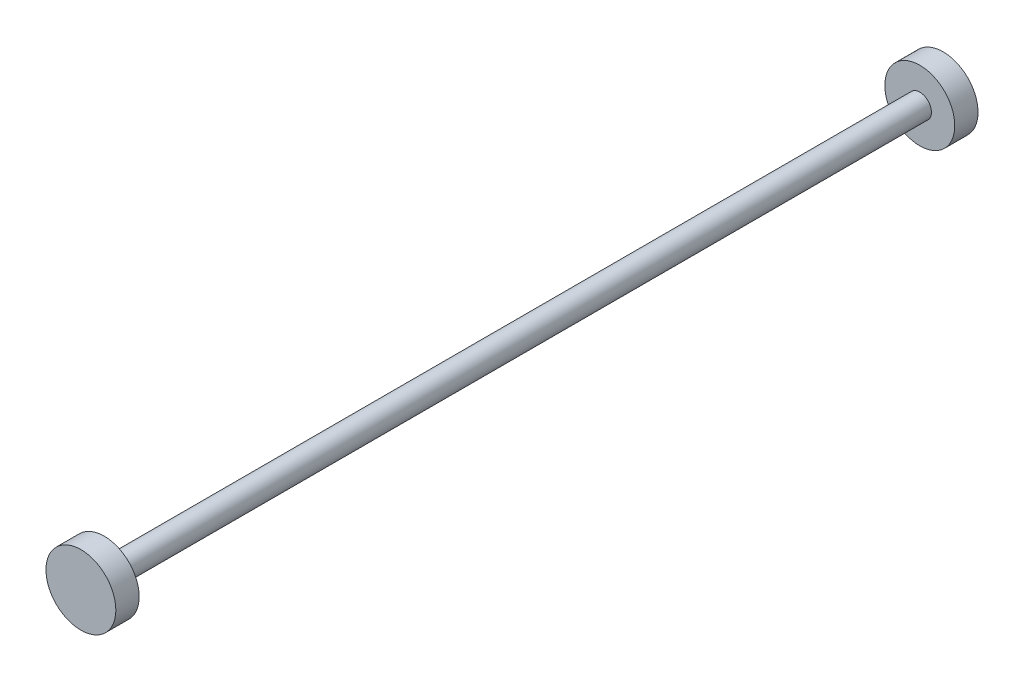
ISO-10303-21;
HEADER;
FILE_DESCRIPTION(('STEP AP214'),'2;1');
FILE_NAME('part.step','',(''),(''),'','','');
FILE_SCHEMA(('AUTOMOTIVE_DESIGN { 1 0 10303 214 1 1 1 1 }'));
ENDSEC;
DATA;
#1=APPLICATION_CONTEXT('core data for automotive mechanical design processes');
#2=APPLICATION_PROTOCOL_DEFINITION('international standard','automotive_design',2000,#1);
#3=PRODUCT_CONTEXT('',#1,'mechanical');
#4=PRODUCT('Part','Part','',(#3));
#5=PRODUCT_RELATED_PRODUCT_CATEGORY('part','',(#4));
#6=PRODUCT_DEFINITION_FORMATION('','',#4);
#7=PRODUCT_DEFINITION_CONTEXT('part definition',#1,'design');
#8=PRODUCT_DEFINITION('design','',#6,#7);
#9=PRODUCT_DEFINITION_SHAPE('','',#8);
#10=(LENGTH_UNIT() NAMED_UNIT(*) SI_UNIT(.MILLI.,.METRE.));
#11=(NAMED_UNIT(*) PLANE_ANGLE_UNIT() SI_UNIT($,.RADIAN.));
#12=(NAMED_UNIT(*) SI_UNIT($,.STERADIAN.) SOLID_ANGLE_UNIT());
#13=UNCERTAINTY_MEASURE_WITH_UNIT(LENGTH_MEASURE(1.E-05),#10,'distance_accuracy_value','');
#14=(GEOMETRIC_REPRESENTATION_CONTEXT(3) GLOBAL_UNCERTAINTY_ASSIGNED_CONTEXT((#13)) GLOBAL_UNIT_ASSIGNED_CONTEXT((#10,
#11,#12)) REPRESENTATION_CONTEXT('',''));
#15=CARTESIAN_POINT('',(0.,0.,0.));
#16=DIRECTION('',(0.,0.,1.));
#17=DIRECTION('',(1.,0.,0.));
#18=AXIS2_PLACEMENT_3D('',#15,#16,#17);
#19=CARTESIAN_POINT('',(-12.2104027011698,19.4427181472472,889.));
#20=DIRECTION('',(0.,0.,-1.));
#21=DIRECTION('',(-1.,0.,0.));
#22=AXIS2_PLACEMENT_3D('',#19,#20,#21);
#23=CYLINDRICAL_SURFACE('',#22,12.7);
#24=CARTESIAN_POINT('',(-12.2104027011698,19.4427181472472,889.));
#25=DIRECTION('',(0.,0.,1.));
#26=DIRECTION('',(1.,0.,0.));
#27=AXIS2_PLACEMENT_3D('',#24,#25,#26);
#28=CIRCLE('',#27,12.7);
#29=CARTESIAN_POINT('',(0.489597298830229,19.4427181472472,889.));
#30=VERTEX_POINT('',#29);
#31=EDGE_CURVE('E10',#30,#30,#28,.T.);
#32=ORIENTED_EDGE('',*,*,#31,.F.);
#33=EDGE_LOOP('',(#32));
#34=FACE_BOUND('',#33,.T.);
#35=CARTESIAN_POINT('',(-12.2104027011698,19.4427181472472,0.));
#36=DIRECTION('',(0.,0.,1.));
#37=DIRECTION('',(1.,0.,0.));
#38=AXIS2_PLACEMENT_3D('',#35,#36,#37);
#39=CIRCLE('',#38,12.7);
#40=CARTESIAN_POINT('',(0.489597298830229,19.4427181472472,0.));
#41=VERTEX_POINT('',#40);
#42=EDGE_CURVE('E40',#41,#41,#39,.T.);
#43=ORIENTED_EDGE('',*,*,#42,.T.);
#44=EDGE_LOOP('',(#43));
#45=FACE_BOUND('',#44,.T.);
#46=ADVANCED_FACE('F37',(#34,#45),#23,.T.);
#47=CARTESIAN_POINT('',(-12.2104027011698,19.4427181472472,914.4));
#48=DIRECTION('',(0.,0.,-1.));
#49=DIRECTION('',(-1.,0.,0.));
#50=AXIS2_PLACEMENT_3D('',#47,#48,#49);
#51=CYLINDRICAL_SURFACE('',#50,38.1);
#52=CARTESIAN_POINT('',(-12.2104027011698,19.4427181472472,914.4));
#53=DIRECTION('',(0.,0.,1.));
#54=DIRECTION('',(1.,0.,0.));
#55=AXIS2_PLACEMENT_3D('',#52,#53,#54);
#56=CIRCLE('',#55,38.1);
#57=CARTESIAN_POINT('',(25.8895972988302,19.4427181472472,914.4));
#58=VERTEX_POINT('',#57);
#59=EDGE_CURVE('E44',#58,#58,#56,.T.);
#60=ORIENTED_EDGE('',*,*,#59,.F.);
#61=EDGE_LOOP('',(#60));
#62=FACE_BOUND('',#61,.T.);
#63=CARTESIAN_POINT('',(-12.2104027011698,19.4427181472472,889.));
#64=DIRECTION('',(0.,0.,1.));
#65=DIRECTION('',(1.,0.,0.));
#66=AXIS2_PLACEMENT_3D('',#63,#64,#65);
#67=CIRCLE('',#66,38.1);
#68=CARTESIAN_POINT('',(25.8895972988302,19.4427181472472,889.));
#69=VERTEX_POINT('',#68);
#70=EDGE_CURVE('E48',#69,#69,#67,.T.);
#71=ORIENTED_EDGE('',*,*,#70,.T.);
#72=EDGE_LOOP('',(#71));
#73=FACE_BOUND('',#72,.T.);
#74=ADVANCED_FACE('F85',(#62,#73),#51,.T.);
#75=CARTESIAN_POINT('',(-12.2104027011698,19.4427181472472,914.4));
#76=DIRECTION('',(0.,0.,1.));
#77=DIRECTION('',(1.,0.,0.));
#78=AXIS2_PLACEMENT_3D('',#75,#76,#77);
#79=PLANE('',#78);
#80=ORIENTED_EDGE('',*,*,#59,.T.);
#81=EDGE_LOOP('',(#80));
#82=FACE_BOUND('',#81,.T.);
#83=ADVANCED_FACE('F81',(#82),#79,.T.);
#84=CARTESIAN_POINT('',(-12.2104027011698,19.4427181472472,889.));
#85=DIRECTION('',(0.,0.,1.));
#86=DIRECTION('',(1.,0.,0.));
#87=AXIS2_PLACEMENT_3D('',#84,#85,#86);
#88=PLANE('',#87);
#89=ORIENTED_EDGE('',*,*,#31,.T.);
#90=EDGE_LOOP('',(#89));
#91=FACE_BOUND('',#90,.T.);
#92=ORIENTED_EDGE('',*,*,#70,.F.);
#93=EDGE_LOOP('',(#92));
#94=FACE_BOUND('',#93,.T.);
#95=ADVANCED_FACE('F73',(#91,#94),#88,.F.);
#96=CARTESIAN_POINT('',(-12.2104027011698,19.4427181472472,-25.4));
#97=DIRECTION('',(0.,0.,1.));
#98=DIRECTION('',(1.,0.,0.));
#99=AXIS2_PLACEMENT_3D('',#96,#97,#98);
#100=CYLINDRICAL_SURFACE('',#99,38.1);
#101=CARTESIAN_POINT('',(-12.2104027011698,19.4427181472472,-25.4));
#102=DIRECTION('',(0.,0.,-1.));
#103=DIRECTION('',(-1.,0.,0.));
#104=AXIS2_PLACEMENT_3D('',#101,#102,#103);
#105=CIRCLE('',#104,38.1);
#106=CARTESIAN_POINT('',(-50.3104027011698,19.4427181472472,-25.4));
#107=VERTEX_POINT('',#106);
#108=EDGE_CURVE('E56',#107,#107,#105,.T.);
#109=ORIENTED_EDGE('',*,*,#108,.F.);
#110=EDGE_LOOP('',(#109));
#111=FACE_BOUND('',#110,.T.);
#112=CARTESIAN_POINT('',(-12.2104027011698,19.4427181472472,0.));
#113=DIRECTION('',(0.,0.,-1.));
#114=DIRECTION('',(-1.,0.,0.));
#115=AXIS2_PLACEMENT_3D('',#112,#113,#114);
#116=CIRCLE('',#115,38.1);
#117=CARTESIAN_POINT('',(-50.3104027011698,19.4427181472472,0.));
#118=VERTEX_POINT('',#117);
#119=EDGE_CURVE('E53',#118,#118,#116,.T.);
#120=ORIENTED_EDGE('',*,*,#119,.T.);
#121=EDGE_LOOP('',(#120));
#122=FACE_BOUND('',#121,.T.);
#123=ADVANCED_FACE('F71',(#111,#122),#100,.T.);
#124=CARTESIAN_POINT('',(-12.2104027011698,19.4427181472472,-25.4));
#125=DIRECTION('',(0.,0.,-1.));
#126=DIRECTION('',(-1.,0.,0.));
#127=AXIS2_PLACEMENT_3D('',#124,#125,#126);
#128=PLANE('',#127);
#129=ORIENTED_EDGE('',*,*,#108,.T.);
#130=EDGE_LOOP('',(#129));
#131=FACE_BOUND('',#130,.T.);
#132=ADVANCED_FACE('F67',(#131),#128,.T.);
#133=CARTESIAN_POINT('',(-12.2104027011698,19.4427181472472,0.));
#134=DIRECTION('',(0.,0.,-1.));
#135=DIRECTION('',(-1.,0.,0.));
#136=AXIS2_PLACEMENT_3D('',#133,#134,#135);
#137=PLANE('',#136);
#138=ORIENTED_EDGE('',*,*,#42,.F.);
#139=EDGE_LOOP('',(#138));
#140=FACE_BOUND('',#139,.T.);
#141=ORIENTED_EDGE('',*,*,#119,.F.);
#142=EDGE_LOOP('',(#141));
#143=FACE_BOUND('',#142,.T.);
#144=ADVANCED_FACE('F64',(#140,#143),#137,.F.);
#145=CLOSED_SHELL('',(#46,#74,#83,#95,#123,#132,#144));
#146=MANIFOLD_SOLID_BREP('B2',#145);
#147=ADVANCED_BREP_SHAPE_REPRESENTATION('',(#18,#146),#14);
#148=SHAPE_DEFINITION_REPRESENTATION(#9,#147);
ENDSEC;
END-ISO-10303-21;
